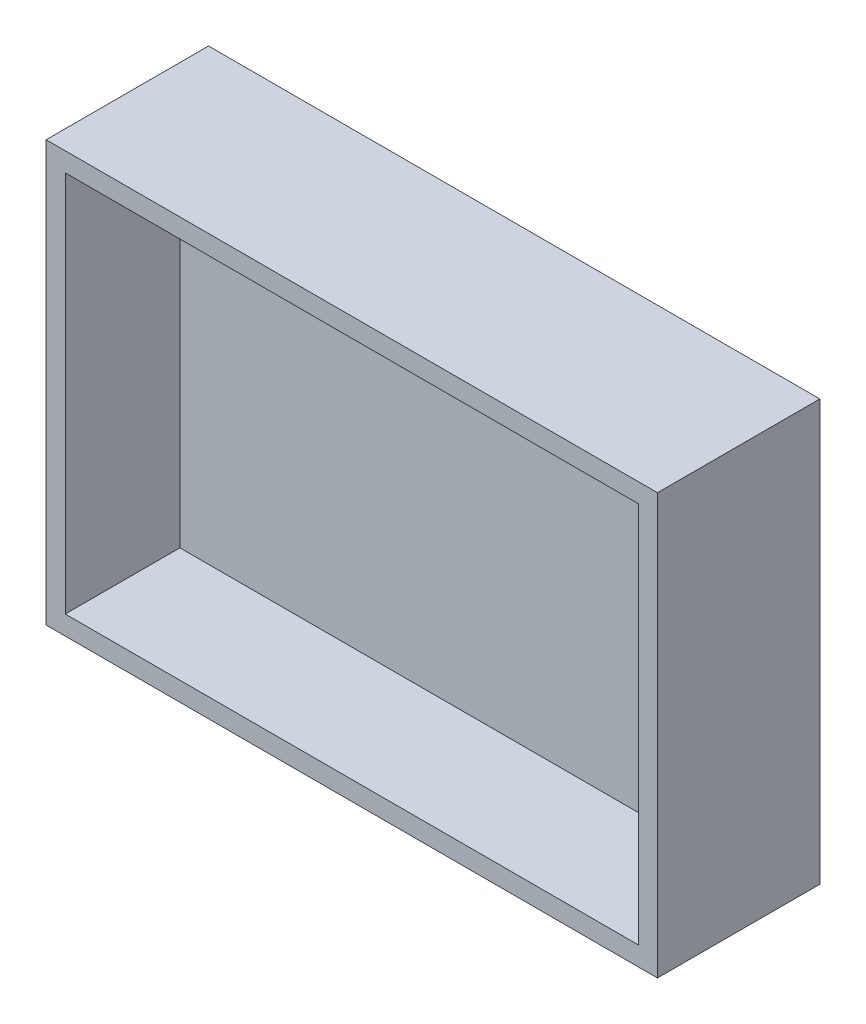
ISO-10303-21;
HEADER;
FILE_DESCRIPTION(('STEP AP214'),'2;1');
FILE_NAME('part.step','',(''),(''),'','','');
FILE_SCHEMA(('AUTOMOTIVE_DESIGN { 1 0 10303 214 1 1 1 1 }'));
ENDSEC;
DATA;
#1=APPLICATION_CONTEXT('core data for automotive mechanical design processes');
#2=APPLICATION_PROTOCOL_DEFINITION('international standard','automotive_design',2000,#1);
#3=PRODUCT_CONTEXT('',#1,'mechanical');
#4=PRODUCT('Part','Part','',(#3));
#5=PRODUCT_RELATED_PRODUCT_CATEGORY('part','',(#4));
#6=PRODUCT_DEFINITION_FORMATION('','',#4);
#7=PRODUCT_DEFINITION_CONTEXT('part definition',#1,'design');
#8=PRODUCT_DEFINITION('design','',#6,#7);
#9=PRODUCT_DEFINITION_SHAPE('','',#8);
#10=(LENGTH_UNIT() NAMED_UNIT(*) SI_UNIT(.MILLI.,.METRE.));
#11=(NAMED_UNIT(*) PLANE_ANGLE_UNIT() SI_UNIT($,.RADIAN.));
#12=(NAMED_UNIT(*) SI_UNIT($,.STERADIAN.) SOLID_ANGLE_UNIT());
#13=UNCERTAINTY_MEASURE_WITH_UNIT(LENGTH_MEASURE(1.E-05),#10,'distance_accuracy_value','');
#14=(GEOMETRIC_REPRESENTATION_CONTEXT(3) GLOBAL_UNCERTAINTY_ASSIGNED_CONTEXT((#13)) GLOBAL_UNIT_ASSIGNED_CONTEXT((#10,
#11,#12)) REPRESENTATION_CONTEXT('',''));
#15=CARTESIAN_POINT('',(0.,0.,0.));
#16=DIRECTION('',(0.,0.,1.));
#17=DIRECTION('',(1.,0.,0.));
#18=AXIS2_PLACEMENT_3D('',#15,#16,#17);
#19=CARTESIAN_POINT('',(0.,0.,12.));
#20=DIRECTION('',(0.,0.,1.));
#21=DIRECTION('',(1.,0.,0.));
#22=AXIS2_PLACEMENT_3D('',#19,#20,#21);
#23=PLANE('',#22);
#24=DIRECTION('',(0.,1.,0.));
#25=VECTOR('',#24,1.);
#26=CARTESIAN_POINT('',(2.,-1.99999999999999,12.));
#27=LINE('',#26,#25);
#28=CARTESIAN_POINT('',(2.,-1.99999999999999,12.));
#29=VERTEX_POINT('',#28);
#30=CARTESIAN_POINT('',(2.,42.,12.));
#31=VERTEX_POINT('',#30);
#32=EDGE_CURVE('E114',#29,#31,#27,.T.);
#33=ORIENTED_EDGE('',*,*,#32,.T.);
#34=DIRECTION('',(-1.,0.,0.));
#35=VECTOR('',#34,1.);
#36=CARTESIAN_POINT('',(2.,42.,12.));
#37=LINE('',#36,#35);
#38=CARTESIAN_POINT('',(-62.,42.,12.));
#39=VERTEX_POINT('',#38);
#40=EDGE_CURVE('E182',#31,#39,#37,.T.);
#41=ORIENTED_EDGE('',*,*,#40,.T.);
#42=DIRECTION('',(0.,-1.,0.));
#43=VECTOR('',#42,1.);
#44=CARTESIAN_POINT('',(-62.,-2.,12.));
#45=LINE('',#44,#43);
#46=CARTESIAN_POINT('',(-62.,-2.,12.));
#47=VERTEX_POINT('',#46);
#48=EDGE_CURVE('E185',#39,#47,#45,.T.);
#49=ORIENTED_EDGE('',*,*,#48,.T.);
#50=DIRECTION('',(1.,0.,0.));
#51=VECTOR('',#50,1.);
#52=CARTESIAN_POINT('',(2.,-1.99999999999999,12.));
#53=LINE('',#52,#51);
#54=EDGE_CURVE('E67',#47,#29,#53,.T.);
#55=ORIENTED_EDGE('',*,*,#54,.T.);
#56=EDGE_LOOP('',(#33,#41,#49,#55));
#57=FACE_BOUND('',#56,.T.);
#58=DIRECTION('',(-1.,0.,0.));
#59=VECTOR('',#58,1.);
#60=CARTESIAN_POINT('',(0.,40.,12.));
#61=LINE('',#60,#59);
#62=CARTESIAN_POINT('',(0.,40.,12.));
#63=VERTEX_POINT('',#62);
#64=CARTESIAN_POINT('',(-60.,40.,12.));
#65=VERTEX_POINT('',#64);
#66=EDGE_CURVE('E144',#63,#65,#61,.T.);
#67=ORIENTED_EDGE('',*,*,#66,.F.);
#68=DIRECTION('',(0.,1.,0.));
#69=VECTOR('',#68,1.);
#70=CARTESIAN_POINT('',(0.,0.,12.));
#71=LINE('',#70,#69);
#72=CARTESIAN_POINT('',(0.,0.,12.));
#73=VERTEX_POINT('',#72);
#74=EDGE_CURVE('E141',#73,#63,#71,.T.);
#75=ORIENTED_EDGE('',*,*,#74,.F.);
#76=DIRECTION('',(1.,0.,0.));
#77=VECTOR('',#76,1.);
#78=CARTESIAN_POINT('',(0.,0.,12.));
#79=LINE('',#78,#77);
#80=CARTESIAN_POINT('',(-60.,0.,12.));
#81=VERTEX_POINT('',#80);
#82=EDGE_CURVE('E151',#81,#73,#79,.T.);
#83=ORIENTED_EDGE('',*,*,#82,.F.);
#84=DIRECTION('',(0.,-1.,0.));
#85=VECTOR('',#84,1.);
#86=CARTESIAN_POINT('',(-60.,0.,12.));
#87=LINE('',#86,#85);
#88=EDGE_CURVE('E148',#65,#81,#87,.T.);
#89=ORIENTED_EDGE('',*,*,#88,.F.);
#90=EDGE_LOOP('',(#67,#75,#83,#89));
#91=FACE_BOUND('',#90,.T.);
#92=ADVANCED_FACE('F43',(#57,#91),#23,.T.);
#93=CARTESIAN_POINT('',(2.,-1.99999999999999,12.));
#94=DIRECTION('',(-1.,0.,0.));
#95=DIRECTION('',(0.,0.,1.));
#96=AXIS2_PLACEMENT_3D('',#93,#94,#95);
#97=PLANE('',#96);
#98=DIRECTION('',(0.,0.,-1.));
#99=VECTOR('',#98,1.);
#100=CARTESIAN_POINT('',(2.,-1.99999999999999,12.));
#101=LINE('',#100,#99);
#102=CARTESIAN_POINT('',(2.,-2.,-5.));
#103=VERTEX_POINT('',#102);
#104=EDGE_CURVE('E109',#29,#103,#101,.T.);
#105=ORIENTED_EDGE('',*,*,#104,.T.);
#106=DIRECTION('',(0.,-1.,0.));
#107=VECTOR('',#106,1.);
#108=CARTESIAN_POINT('',(2.,42.,-5.));
#109=LINE('',#108,#107);
#110=CARTESIAN_POINT('',(2.,42.,-5.));
#111=VERTEX_POINT('',#110);
#112=EDGE_CURVE('E113',#111,#103,#109,.T.);
#113=ORIENTED_EDGE('',*,*,#112,.F.);
#114=DIRECTION('',(0.,0.,-1.));
#115=VECTOR('',#114,1.);
#116=CARTESIAN_POINT('',(2.,42.,12.));
#117=LINE('',#116,#115);
#118=EDGE_CURVE('E11',#31,#111,#117,.T.);
#119=ORIENTED_EDGE('',*,*,#118,.F.);
#120=ORIENTED_EDGE('',*,*,#32,.F.);
#121=EDGE_LOOP('',(#105,#113,#119,#120));
#122=FACE_BOUND('',#121,.T.);
#123=ADVANCED_FACE('F45',(#122),#97,.F.);
#124=CARTESIAN_POINT('',(2.,42.,12.));
#125=DIRECTION('',(0.,-1.,0.));
#126=DIRECTION('',(0.,0.,-1.));
#127=AXIS2_PLACEMENT_3D('',#124,#125,#126);
#128=PLANE('',#127);
#129=ORIENTED_EDGE('',*,*,#118,.T.);
#130=DIRECTION('',(1.,0.,0.));
#131=VECTOR('',#130,1.);
#132=CARTESIAN_POINT('',(2.,42.,-5.));
#133=LINE('',#132,#131);
#134=CARTESIAN_POINT('',(-62.,42.,-5.));
#135=VERTEX_POINT('',#134);
#136=EDGE_CURVE('E132',#135,#111,#133,.T.);
#137=ORIENTED_EDGE('',*,*,#136,.F.);
#138=DIRECTION('',(0.,0.,-1.));
#139=VECTOR('',#138,1.);
#140=CARTESIAN_POINT('',(-62.,42.,12.));
#141=LINE('',#140,#139);
#142=EDGE_CURVE('E52',#39,#135,#141,.T.);
#143=ORIENTED_EDGE('',*,*,#142,.F.);
#144=ORIENTED_EDGE('',*,*,#40,.F.);
#145=EDGE_LOOP('',(#129,#137,#143,#144));
#146=FACE_BOUND('',#145,.T.);
#147=ADVANCED_FACE('F197',(#146),#128,.F.);
#148=CARTESIAN_POINT('',(-62.,-2.,12.));
#149=DIRECTION('',(1.,0.,0.));
#150=DIRECTION('',(0.,0.,-1.));
#151=AXIS2_PLACEMENT_3D('',#148,#149,#150);
#152=PLANE('',#151);
#153=ORIENTED_EDGE('',*,*,#142,.T.);
#154=DIRECTION('',(0.,1.,0.));
#155=VECTOR('',#154,1.);
#156=CARTESIAN_POINT('',(-62.,42.,-5.));
#157=LINE('',#156,#155);
#158=CARTESIAN_POINT('',(-62.,-2.,-5.));
#159=VERTEX_POINT('',#158);
#160=EDGE_CURVE('E127',#159,#135,#157,.T.);
#161=ORIENTED_EDGE('',*,*,#160,.F.);
#162=DIRECTION('',(0.,0.,-1.));
#163=VECTOR('',#162,1.);
#164=CARTESIAN_POINT('',(-62.,-2.,12.));
#165=LINE('',#164,#163);
#166=EDGE_CURVE('E117',#47,#159,#165,.T.);
#167=ORIENTED_EDGE('',*,*,#166,.F.);
#168=ORIENTED_EDGE('',*,*,#48,.F.);
#169=EDGE_LOOP('',(#153,#161,#167,#168));
#170=FACE_BOUND('',#169,.T.);
#171=ADVANCED_FACE('F195',(#170),#152,.F.);
#172=CARTESIAN_POINT('',(2.,-1.99999999999999,12.));
#173=DIRECTION('',(0.,1.,0.));
#174=DIRECTION('',(-1.,0.,0.));
#175=AXIS2_PLACEMENT_3D('',#172,#173,#174);
#176=PLANE('',#175);
#177=ORIENTED_EDGE('',*,*,#166,.T.);
#178=DIRECTION('',(-1.,0.,0.));
#179=VECTOR('',#178,1.);
#180=CARTESIAN_POINT('',(2.,-2.,-5.));
#181=LINE('',#180,#179);
#182=EDGE_CURVE('E120',#103,#159,#181,.T.);
#183=ORIENTED_EDGE('',*,*,#182,.F.);
#184=ORIENTED_EDGE('',*,*,#104,.F.);
#185=ORIENTED_EDGE('',*,*,#54,.F.);
#186=EDGE_LOOP('',(#177,#183,#184,#185));
#187=FACE_BOUND('',#186,.T.);
#188=ADVANCED_FACE('F121',(#187),#176,.F.);
#189=CARTESIAN_POINT('',(0.,0.,12.));
#190=DIRECTION('',(-1.,0.,0.));
#191=DIRECTION('',(0.,-1.,0.));
#192=AXIS2_PLACEMENT_3D('',#189,#190,#191);
#193=PLANE('',#192);
#194=DIRECTION('',(0.,1.,0.));
#195=VECTOR('',#194,1.);
#196=CARTESIAN_POINT('',(0.,0.,0.));
#197=LINE('',#196,#195);
#198=CARTESIAN_POINT('',(0.,0.,0.));
#199=VERTEX_POINT('',#198);
#200=CARTESIAN_POINT('',(0.,40.,0.));
#201=VERTEX_POINT('',#200);
#202=EDGE_CURVE('E140',#199,#201,#197,.T.);
#203=ORIENTED_EDGE('',*,*,#202,.F.);
#204=DIRECTION('',(0.,0.,-1.));
#205=VECTOR('',#204,1.);
#206=CARTESIAN_POINT('',(0.,0.,12.));
#207=LINE('',#206,#205);
#208=EDGE_CURVE('E154',#73,#199,#207,.T.);
#209=ORIENTED_EDGE('',*,*,#208,.F.);
#210=ORIENTED_EDGE('',*,*,#74,.T.);
#211=DIRECTION('',(0.,0.,-1.));
#212=VECTOR('',#211,1.);
#213=CARTESIAN_POINT('',(0.,40.,12.));
#214=LINE('',#213,#212);
#215=EDGE_CURVE('E176',#63,#201,#214,.T.);
#216=ORIENTED_EDGE('',*,*,#215,.T.);
#217=EDGE_LOOP('',(#203,#209,#210,#216));
#218=FACE_BOUND('',#217,.T.);
#219=ADVANCED_FACE('F216',(#218),#193,.T.);
#220=CARTESIAN_POINT('',(0.,40.,12.));
#221=DIRECTION('',(0.,-1.,0.));
#222=DIRECTION('',(1.,0.,0.));
#223=AXIS2_PLACEMENT_3D('',#220,#221,#222);
#224=PLANE('',#223);
#225=DIRECTION('',(-1.,0.,0.));
#226=VECTOR('',#225,1.);
#227=CARTESIAN_POINT('',(0.,40.,0.));
#228=LINE('',#227,#226);
#229=CARTESIAN_POINT('',(-60.,40.,0.));
#230=VERTEX_POINT('',#229);
#231=EDGE_CURVE('E158',#201,#230,#228,.T.);
#232=ORIENTED_EDGE('',*,*,#231,.F.);
#233=ORIENTED_EDGE('',*,*,#215,.F.);
#234=ORIENTED_EDGE('',*,*,#66,.T.);
#235=DIRECTION('',(0.,0.,-1.));
#236=VECTOR('',#235,1.);
#237=CARTESIAN_POINT('',(-60.,40.,12.));
#238=LINE('',#237,#236);
#239=EDGE_CURVE('E173',#65,#230,#238,.T.);
#240=ORIENTED_EDGE('',*,*,#239,.T.);
#241=EDGE_LOOP('',(#232,#233,#234,#240));
#242=FACE_BOUND('',#241,.T.);
#243=ADVANCED_FACE('F208',(#242),#224,.T.);
#244=CARTESIAN_POINT('',(-60.,0.,12.));
#245=DIRECTION('',(1.,0.,0.));
#246=DIRECTION('',(0.,0.,-1.));
#247=AXIS2_PLACEMENT_3D('',#244,#245,#246);
#248=PLANE('',#247);
#249=DIRECTION('',(0.,-1.,0.));
#250=VECTOR('',#249,1.);
#251=CARTESIAN_POINT('',(-60.,0.,0.));
#252=LINE('',#251,#250);
#253=CARTESIAN_POINT('',(-60.,0.,0.));
#254=VERTEX_POINT('',#253);
#255=EDGE_CURVE('E162',#230,#254,#252,.T.);
#256=ORIENTED_EDGE('',*,*,#255,.F.);
#257=ORIENTED_EDGE('',*,*,#239,.F.);
#258=ORIENTED_EDGE('',*,*,#88,.T.);
#259=DIRECTION('',(0.,0.,-1.));
#260=VECTOR('',#259,1.);
#261=CARTESIAN_POINT('',(-60.,0.,12.));
#262=LINE('',#261,#260);
#263=EDGE_CURVE('E59',#81,#254,#262,.T.);
#264=ORIENTED_EDGE('',*,*,#263,.T.);
#265=EDGE_LOOP('',(#256,#257,#258,#264));
#266=FACE_BOUND('',#265,.T.);
#267=ADVANCED_FACE('F211',(#266),#248,.T.);
#268=CARTESIAN_POINT('',(0.,0.,12.));
#269=DIRECTION('',(0.,1.,0.));
#270=DIRECTION('',(0.,0.,1.));
#271=AXIS2_PLACEMENT_3D('',#268,#269,#270);
#272=PLANE('',#271);
#273=DIRECTION('',(1.,0.,0.));
#274=VECTOR('',#273,1.);
#275=CARTESIAN_POINT('',(0.,0.,0.));
#276=LINE('',#275,#274);
#277=EDGE_CURVE('E145',#254,#199,#276,.T.);
#278=ORIENTED_EDGE('',*,*,#277,.F.);
#279=ORIENTED_EDGE('',*,*,#263,.F.);
#280=ORIENTED_EDGE('',*,*,#82,.T.);
#281=ORIENTED_EDGE('',*,*,#208,.T.);
#282=EDGE_LOOP('',(#278,#279,#280,#281));
#283=FACE_BOUND('',#282,.T.);
#284=ADVANCED_FACE('F218',(#283),#272,.T.);
#285=CARTESIAN_POINT('',(0.,0.,0.));
#286=DIRECTION('',(0.,0.,-1.));
#287=DIRECTION('',(-1.,0.,0.));
#288=AXIS2_PLACEMENT_3D('',#285,#286,#287);
#289=PLANE('',#288);
#290=ORIENTED_EDGE('',*,*,#277,.T.);
#291=ORIENTED_EDGE('',*,*,#202,.T.);
#292=ORIENTED_EDGE('',*,*,#231,.T.);
#293=ORIENTED_EDGE('',*,*,#255,.T.);
#294=EDGE_LOOP('',(#290,#291,#292,#293));
#295=FACE_BOUND('',#294,.T.);
#296=ADVANCED_FACE('F213',(#295),#289,.F.);
#297=CARTESIAN_POINT('',(0.,0.,-5.));
#298=DIRECTION('',(0.,0.,-1.));
#299=DIRECTION('',(-1.,0.,0.));
#300=AXIS2_PLACEMENT_3D('',#297,#298,#299);
#301=PLANE('',#300);
#302=ORIENTED_EDGE('',*,*,#112,.T.);
#303=ORIENTED_EDGE('',*,*,#182,.T.);
#304=ORIENTED_EDGE('',*,*,#160,.T.);
#305=ORIENTED_EDGE('',*,*,#136,.T.);
#306=EDGE_LOOP('',(#302,#303,#304,#305));
#307=FACE_BOUND('',#306,.T.);
#308=ADVANCED_FACE('F130',(#307),#301,.T.);
#309=CLOSED_SHELL('',(#92,#123,#147,#171,#188,#219,#243,#267,#284,#296,#308));
#310=MANIFOLD_SOLID_BREP('B2',#309);
#311=ADVANCED_BREP_SHAPE_REPRESENTATION('',(#18,#310),#14);
#312=SHAPE_DEFINITION_REPRESENTATION(#9,#311);
ENDSEC;
END-ISO-10303-21;
